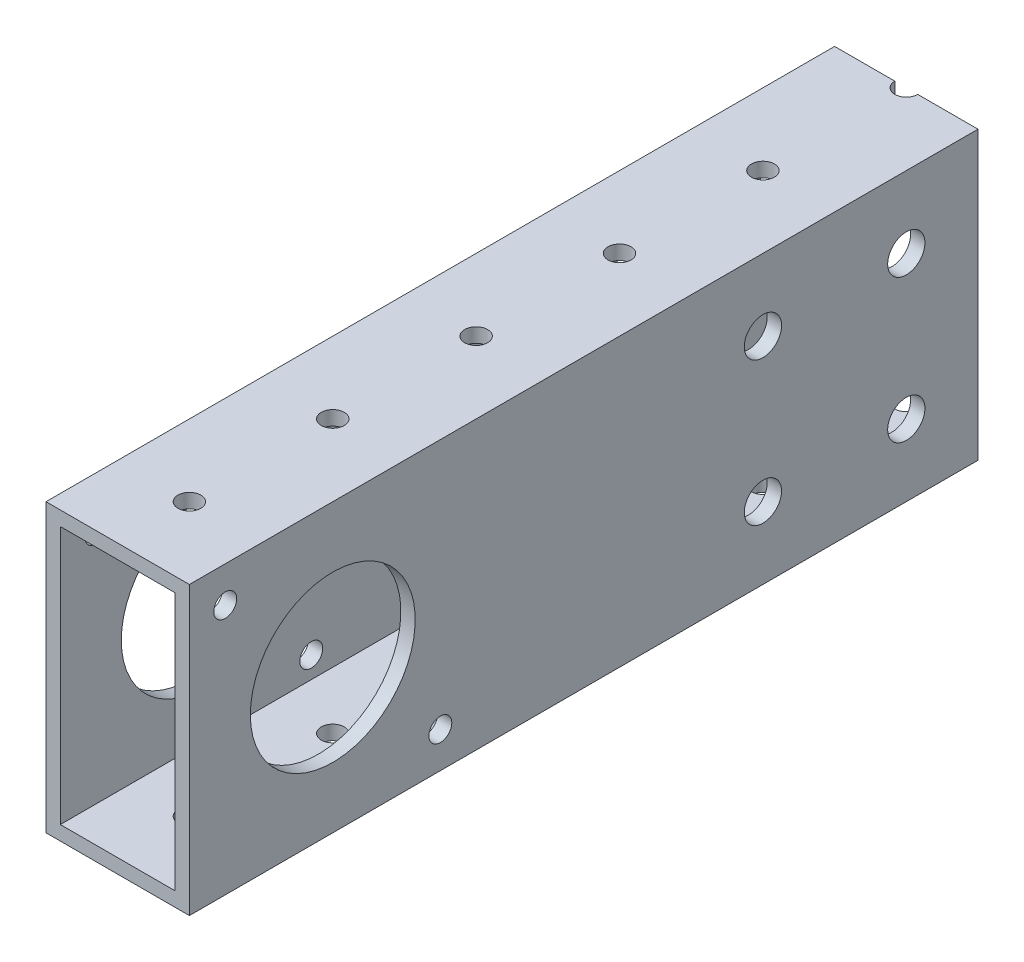
ISO-10303-21;
HEADER;
FILE_DESCRIPTION(('STEP AP214'),'2;1');
FILE_NAME('part.step','',(''),(''),'','','');
FILE_SCHEMA(('AUTOMOTIVE_DESIGN { 1 0 10303 214 1 1 1 1 }'));
ENDSEC;
DATA;
#1=APPLICATION_CONTEXT('core data for automotive mechanical design processes');
#2=APPLICATION_PROTOCOL_DEFINITION('international standard','automotive_design',2000,#1);
#3=PRODUCT_CONTEXT('',#1,'mechanical');
#4=PRODUCT('Part','Part','',(#3));
#5=PRODUCT_RELATED_PRODUCT_CATEGORY('part','',(#4));
#6=PRODUCT_DEFINITION_FORMATION('','',#4);
#7=PRODUCT_DEFINITION_CONTEXT('part definition',#1,'design');
#8=PRODUCT_DEFINITION('design','',#6,#7);
#9=PRODUCT_DEFINITION_SHAPE('','',#8);
#10=(LENGTH_UNIT() NAMED_UNIT(*) SI_UNIT(.MILLI.,.METRE.));
#11=(NAMED_UNIT(*) PLANE_ANGLE_UNIT() SI_UNIT($,.RADIAN.));
#12=(NAMED_UNIT(*) SI_UNIT($,.STERADIAN.) SOLID_ANGLE_UNIT());
#13=UNCERTAINTY_MEASURE_WITH_UNIT(LENGTH_MEASURE(1.E-05),#10,'distance_accuracy_value','');
#14=(GEOMETRIC_REPRESENTATION_CONTEXT(3) GLOBAL_UNCERTAINTY_ASSIGNED_CONTEXT((#13)) GLOBAL_UNIT_ASSIGNED_CONTEXT((#10,
#11,#12)) REPRESENTATION_CONTEXT('',''));
#15=CARTESIAN_POINT('',(0.,0.,0.));
#16=DIRECTION('',(0.,0.,1.));
#17=DIRECTION('',(1.,0.,0.));
#18=AXIS2_PLACEMENT_3D('',#15,#16,#17);
#19=CARTESIAN_POINT('',(0.,0.,0.));
#20=DIRECTION('',(0.,0.,-1.));
#21=DIRECTION('',(-1.,0.,0.));
#22=AXIS2_PLACEMENT_3D('',#19,#20,#21);
#23=PLANE('',#22);
#24=DIRECTION('',(0.,1.,0.));
#25=VECTOR('',#24,1.);
#26=CARTESIAN_POINT('',(-2.032,-25.4,0.));
#27=LINE('',#26,#25);
#28=CARTESIAN_POINT('',(-2.032,-25.4,0.));
#29=VERTEX_POINT('',#28);
#30=CARTESIAN_POINT('',(-2.032,-22.86,0.));
#31=VERTEX_POINT('',#30);
#32=EDGE_CURVE('E49',#29,#31,#27,.T.);
#33=ORIENTED_EDGE('',*,*,#32,.F.);
#34=DIRECTION('',(1.,0.,0.));
#35=VECTOR('',#34,1.);
#36=CARTESIAN_POINT('',(-12.7,-25.4,0.));
#37=LINE('',#36,#35);
#38=CARTESIAN_POINT('',(-12.7,-25.4,0.));
#39=VERTEX_POINT('',#38);
#40=EDGE_CURVE('E137',#39,#29,#37,.T.);
#41=ORIENTED_EDGE('',*,*,#40,.F.);
#42=DIRECTION('',(0.,-1.,0.));
#43=VECTOR('',#42,1.);
#44=CARTESIAN_POINT('',(-12.7,-25.4,0.));
#45=LINE('',#44,#43);
#46=CARTESIAN_POINT('',(-12.7,25.4,0.));
#47=VERTEX_POINT('',#46);
#48=EDGE_CURVE('E144',#47,#39,#45,.T.);
#49=ORIENTED_EDGE('',*,*,#48,.F.);
#50=DIRECTION('',(-1.,0.,0.));
#51=VECTOR('',#50,1.);
#52=CARTESIAN_POINT('',(-12.7,25.4,0.));
#53=LINE('',#52,#51);
#54=CARTESIAN_POINT('',(-2.032,25.4,0.));
#55=VERTEX_POINT('',#54);
#56=EDGE_CURVE('E311',#55,#47,#53,.T.);
#57=ORIENTED_EDGE('',*,*,#56,.F.);
#58=CARTESIAN_POINT('',(-2.032,22.86,0.));
#59=VERTEX_POINT('',#58);
#60=EDGE_CURVE('E267',#59,#55,#27,.T.);
#61=ORIENTED_EDGE('',*,*,#60,.F.);
#62=DIRECTION('',(-1.,0.,0.));
#63=VECTOR('',#62,1.);
#64=CARTESIAN_POINT('',(-10.16,22.86,0.));
#65=LINE('',#64,#63);
#66=CARTESIAN_POINT('',(-10.16,22.86,0.));
#67=VERTEX_POINT('',#66);
#68=EDGE_CURVE('E291',#59,#67,#65,.T.);
#69=ORIENTED_EDGE('',*,*,#68,.T.);
#70=DIRECTION('',(0.,-1.,0.));
#71=VECTOR('',#70,1.);
#72=CARTESIAN_POINT('',(-10.16,-22.86,0.));
#73=LINE('',#72,#71);
#74=CARTESIAN_POINT('',(-10.16,-22.86,0.));
#75=VERTEX_POINT('',#74);
#76=EDGE_CURVE('E281',#67,#75,#73,.T.);
#77=ORIENTED_EDGE('',*,*,#76,.T.);
#78=DIRECTION('',(1.,0.,0.));
#79=VECTOR('',#78,1.);
#80=CARTESIAN_POINT('',(-10.16,-22.86,0.));
#81=LINE('',#80,#79);
#82=EDGE_CURVE('E285',#75,#31,#81,.T.);
#83=ORIENTED_EDGE('',*,*,#82,.T.);
#84=EDGE_LOOP('',(#33,#41,#49,#57,#61,#69,#77,#83));
#85=FACE_BOUND('',#84,.T.);
#86=ADVANCED_FACE('F32',(#85),#23,.T.);
#87=CARTESIAN_POINT('',(0.,0.,139.7));
#88=DIRECTION('',(0.,0.,-1.));
#89=DIRECTION('',(-1.,0.,0.));
#90=AXIS2_PLACEMENT_3D('',#87,#88,#89);
#91=PLANE('',#90);
#92=DIRECTION('',(0.,1.,0.));
#93=VECTOR('',#92,1.);
#94=CARTESIAN_POINT('',(12.7,-25.4,139.7));
#95=LINE('',#94,#93);
#96=CARTESIAN_POINT('',(12.7,-25.4,139.7));
#97=VERTEX_POINT('',#96);
#98=CARTESIAN_POINT('',(12.7,25.4,139.7));
#99=VERTEX_POINT('',#98);
#100=EDGE_CURVE('E146',#97,#99,#95,.T.);
#101=ORIENTED_EDGE('',*,*,#100,.T.);
#102=DIRECTION('',(-1.,0.,0.));
#103=VECTOR('',#102,1.);
#104=CARTESIAN_POINT('',(-12.7,25.4,139.7));
#105=LINE('',#104,#103);
#106=CARTESIAN_POINT('',(-12.7,25.4,139.7));
#107=VERTEX_POINT('',#106);
#108=EDGE_CURVE('E306',#99,#107,#105,.T.);
#109=ORIENTED_EDGE('',*,*,#108,.T.);
#110=DIRECTION('',(0.,-1.,0.));
#111=VECTOR('',#110,1.);
#112=CARTESIAN_POINT('',(-12.7,-25.4,139.7));
#113=LINE('',#112,#111);
#114=CARTESIAN_POINT('',(-12.7,-25.4,139.7));
#115=VERTEX_POINT('',#114);
#116=EDGE_CURVE('E308',#107,#115,#113,.T.);
#117=ORIENTED_EDGE('',*,*,#116,.T.);
#118=DIRECTION('',(1.,0.,0.));
#119=VECTOR('',#118,1.);
#120=CARTESIAN_POINT('',(-12.7,-25.4,139.7));
#121=LINE('',#120,#119);
#122=EDGE_CURVE('E154',#115,#97,#121,.T.);
#123=ORIENTED_EDGE('',*,*,#122,.T.);
#124=EDGE_LOOP('',(#101,#109,#117,#123));
#125=FACE_BOUND('',#124,.T.);
#126=DIRECTION('',(0.,-1.,0.));
#127=VECTOR('',#126,1.);
#128=CARTESIAN_POINT('',(-10.16,-22.86,139.7));
#129=LINE('',#128,#127);
#130=CARTESIAN_POINT('',(-10.16,22.86,139.7));
#131=VERTEX_POINT('',#130);
#132=CARTESIAN_POINT('',(-10.16,-22.86,139.7));
#133=VERTEX_POINT('',#132);
#134=EDGE_CURVE('E270',#131,#133,#129,.T.);
#135=ORIENTED_EDGE('',*,*,#134,.F.);
#136=DIRECTION('',(-1.,0.,0.));
#137=VECTOR('',#136,1.);
#138=CARTESIAN_POINT('',(-10.16,22.86,139.7));
#139=LINE('',#138,#137);
#140=CARTESIAN_POINT('',(10.16,22.86,139.7));
#141=VERTEX_POINT('',#140);
#142=EDGE_CURVE('E278',#141,#131,#139,.T.);
#143=ORIENTED_EDGE('',*,*,#142,.F.);
#144=DIRECTION('',(0.,1.,0.));
#145=VECTOR('',#144,1.);
#146=CARTESIAN_POINT('',(10.16,-22.86,139.7));
#147=LINE('',#146,#145);
#148=CARTESIAN_POINT('',(10.16,-22.86,139.7));
#149=VERTEX_POINT('',#148);
#150=EDGE_CURVE('E275',#149,#141,#147,.T.);
#151=ORIENTED_EDGE('',*,*,#150,.F.);
#152=DIRECTION('',(1.,0.,0.));
#153=VECTOR('',#152,1.);
#154=CARTESIAN_POINT('',(-10.16,-22.86,139.7));
#155=LINE('',#154,#153);
#156=EDGE_CURVE('E272',#133,#149,#155,.T.);
#157=ORIENTED_EDGE('',*,*,#156,.F.);
#158=EDGE_LOOP('',(#135,#143,#151,#157));
#159=FACE_BOUND('',#158,.T.);
#160=ADVANCED_FACE('F336',(#125,#159),#91,.F.);
#161=DIRECTION('',(0.,1.,0.));
#162=VECTOR('',#161,1.);
#163=CARTESIAN_POINT('',(2.032,-25.4,0.));
#164=LINE('',#163,#162);
#165=CARTESIAN_POINT('',(2.032,25.4,0.));
#166=VERTEX_POINT('',#165);
#167=CARTESIAN_POINT('',(2.032,22.86,0.));
#168=VERTEX_POINT('',#167);
#169=EDGE_CURVE('E56',#166,#168,#164,.F.);
#170=ORIENTED_EDGE('',*,*,#169,.F.);
#171=CARTESIAN_POINT('',(12.7,25.4,0.));
#172=VERTEX_POINT('',#171);
#173=EDGE_CURVE('E147',#172,#166,#53,.T.);
#174=ORIENTED_EDGE('',*,*,#173,.F.);
#175=DIRECTION('',(0.,1.,0.));
#176=VECTOR('',#175,1.);
#177=CARTESIAN_POINT('',(12.7,-25.4,0.));
#178=LINE('',#177,#176);
#179=CARTESIAN_POINT('',(12.7,-25.4,0.));
#180=VERTEX_POINT('',#179);
#181=EDGE_CURVE('E143',#180,#172,#178,.T.);
#182=ORIENTED_EDGE('',*,*,#181,.F.);
#183=CARTESIAN_POINT('',(2.032,-25.4,0.));
#184=VERTEX_POINT('',#183);
#185=EDGE_CURVE('E133',#184,#180,#37,.T.);
#186=ORIENTED_EDGE('',*,*,#185,.F.);
#187=CARTESIAN_POINT('',(2.032,-22.86,0.));
#188=VERTEX_POINT('',#187);
#189=EDGE_CURVE('E120',#188,#184,#164,.F.);
#190=ORIENTED_EDGE('',*,*,#189,.F.);
#191=CARTESIAN_POINT('',(10.16,-22.86,0.));
#192=VERTEX_POINT('',#191);
#193=EDGE_CURVE('E284',#188,#192,#81,.T.);
#194=ORIENTED_EDGE('',*,*,#193,.T.);
#195=DIRECTION('',(0.,1.,0.));
#196=VECTOR('',#195,1.);
#197=CARTESIAN_POINT('',(10.16,-22.86,0.));
#198=LINE('',#197,#196);
#199=CARTESIAN_POINT('',(10.16,22.86,0.));
#200=VERTEX_POINT('',#199);
#201=EDGE_CURVE('E288',#192,#200,#198,.T.);
#202=ORIENTED_EDGE('',*,*,#201,.T.);
#203=EDGE_CURVE('E273',#200,#168,#65,.T.);
#204=ORIENTED_EDGE('',*,*,#203,.T.);
#205=EDGE_LOOP('',(#170,#174,#182,#186,#190,#194,#202,#204));
#206=FACE_BOUND('',#205,.T.);
#207=ADVANCED_FACE('F141',(#206),#23,.T.);
#208=CARTESIAN_POINT('',(12.7,-25.4,139.7));
#209=DIRECTION('',(-1.,0.,0.));
#210=DIRECTION('',(0.,0.,1.));
#211=AXIS2_PLACEMENT_3D('',#208,#209,#210);
#212=PLANE('',#211);
#213=CARTESIAN_POINT('',(12.7,-12.7,12.7));
#214=DIRECTION('',(-1.,0.,0.));
#215=DIRECTION('',(0.,0.,-1.));
#216=AXIS2_PLACEMENT_3D('',#213,#214,#215);
#217=CIRCLE('',#216,3.302);
#218=CARTESIAN_POINT('',(12.7,-12.7,9.39799999999999));
#219=VERTEX_POINT('',#218);
#220=EDGE_CURVE('E377',#219,#219,#217,.T.);
#221=ORIENTED_EDGE('',*,*,#220,.T.);
#222=EDGE_LOOP('',(#221));
#223=FACE_BOUND('',#222,.T.);
#224=CARTESIAN_POINT('',(12.7,-12.7,38.1));
#225=DIRECTION('',(-1.,0.,0.));
#226=DIRECTION('',(0.,0.,-1.));
#227=AXIS2_PLACEMENT_3D('',#224,#225,#226);
#228=CIRCLE('',#227,3.302);
#229=CARTESIAN_POINT('',(12.7,-12.7,34.798));
#230=VERTEX_POINT('',#229);
#231=EDGE_CURVE('E381',#230,#230,#228,.T.);
#232=ORIENTED_EDGE('',*,*,#231,.T.);
#233=EDGE_LOOP('',(#232));
#234=FACE_BOUND('',#233,.T.);
#235=CARTESIAN_POINT('',(12.7,12.7,38.1));
#236=DIRECTION('',(-1.,0.,0.));
#237=DIRECTION('',(0.,0.,1.));
#238=AXIS2_PLACEMENT_3D('',#235,#236,#237);
#239=CIRCLE('',#238,3.302);
#240=CARTESIAN_POINT('',(12.7,12.7,41.402));
#241=VERTEX_POINT('',#240);
#242=EDGE_CURVE('E385',#241,#241,#239,.T.);
#243=ORIENTED_EDGE('',*,*,#242,.T.);
#244=EDGE_LOOP('',(#243));
#245=FACE_BOUND('',#244,.T.);
#246=CARTESIAN_POINT('',(12.7,12.7,12.7));
#247=DIRECTION('',(-1.,0.,0.));
#248=DIRECTION('',(0.,0.,1.));
#249=AXIS2_PLACEMENT_3D('',#246,#247,#248);
#250=CIRCLE('',#249,3.302);
#251=CARTESIAN_POINT('',(12.7,12.7,16.002));
#252=VERTEX_POINT('',#251);
#253=EDGE_CURVE('E389',#252,#252,#250,.T.);
#254=ORIENTED_EDGE('',*,*,#253,.T.);
#255=EDGE_LOOP('',(#254));
#256=FACE_BOUND('',#255,.T.);
#257=CARTESIAN_POINT('',(12.7,0.,114.3));
#258=DIRECTION('',(-1.,0.,0.));
#259=DIRECTION('',(0.,0.,1.));
#260=AXIS2_PLACEMENT_3D('',#257,#258,#259);
#261=CIRCLE('',#260,14.605);
#262=CARTESIAN_POINT('',(12.7,0.,128.905));
#263=VERTEX_POINT('',#262);
#264=EDGE_CURVE('E393',#263,#263,#261,.T.);
#265=ORIENTED_EDGE('',*,*,#264,.T.);
#266=EDGE_LOOP('',(#265));
#267=FACE_BOUND('',#266,.T.);
#268=CARTESIAN_POINT('',(12.7,-19.05,95.25));
#269=DIRECTION('',(-1.,0.,0.));
#270=DIRECTION('',(0.,0.,1.));
#271=AXIS2_PLACEMENT_3D('',#268,#269,#270);
#272=CIRCLE('',#271,2.03200000000001);
#273=CARTESIAN_POINT('',(12.7,-19.05,97.282));
#274=VERTEX_POINT('',#273);
#275=EDGE_CURVE('E191',#274,#274,#272,.T.);
#276=ORIENTED_EDGE('',*,*,#275,.T.);
#277=EDGE_LOOP('',(#276));
#278=FACE_BOUND('',#277,.T.);
#279=CARTESIAN_POINT('',(12.7,19.05,133.35));
#280=DIRECTION('',(-1.,0.,0.));
#281=DIRECTION('',(0.,0.,1.));
#282=AXIS2_PLACEMENT_3D('',#279,#280,#281);
#283=CIRCLE('',#282,2.03200000000001);
#284=CARTESIAN_POINT('',(12.7,19.05,135.382));
#285=VERTEX_POINT('',#284);
#286=EDGE_CURVE('E186',#285,#285,#283,.T.);
#287=ORIENTED_EDGE('',*,*,#286,.T.);
#288=EDGE_LOOP('',(#287));
#289=FACE_BOUND('',#288,.T.);
#290=ORIENTED_EDGE('',*,*,#181,.T.);
#291=DIRECTION('',(0.,0.,-1.));
#292=VECTOR('',#291,1.);
#293=CARTESIAN_POINT('',(12.7,25.4,139.7));
#294=LINE('',#293,#292);
#295=EDGE_CURVE('E41',#99,#172,#294,.T.);
#296=ORIENTED_EDGE('',*,*,#295,.F.);
#297=ORIENTED_EDGE('',*,*,#100,.F.);
#298=DIRECTION('',(0.,0.,-1.));
#299=VECTOR('',#298,1.);
#300=CARTESIAN_POINT('',(12.7,-25.4,139.7));
#301=LINE('',#300,#299);
#302=EDGE_CURVE('E151',#97,#180,#301,.T.);
#303=ORIENTED_EDGE('',*,*,#302,.T.);
#304=EDGE_LOOP('',(#290,#296,#297,#303));
#305=FACE_BOUND('',#304,.T.);
#306=ADVANCED_FACE('F34',(#223,#234,#245,#256,#267,#278,#289,#305),#212,.F.);
#307=CARTESIAN_POINT('',(-12.7,25.4,139.7));
#308=DIRECTION('',(0.,-1.,0.));
#309=DIRECTION('',(0.,0.,-1.));
#310=AXIS2_PLACEMENT_3D('',#307,#308,#309);
#311=PLANE('',#310);
#312=CARTESIAN_POINT('',(0.,25.4,25.4));
#313=DIRECTION('',(0.,1.,0.));
#314=DIRECTION('',(0.,0.,1.));
#315=AXIS2_PLACEMENT_3D('',#312,#313,#314);
#316=CIRCLE('',#315,2.032);
#317=CARTESIAN_POINT('',(0.,25.4,27.432));
#318=VERTEX_POINT('',#317);
#319=EDGE_CURVE('E230',#318,#318,#316,.T.);
#320=ORIENTED_EDGE('',*,*,#319,.F.);
#321=EDGE_LOOP('',(#320));
#322=FACE_BOUND('',#321,.T.);
#323=CARTESIAN_POINT('',(0.,25.4,50.8));
#324=DIRECTION('',(0.,1.,0.));
#325=DIRECTION('',(0.,0.,1.));
#326=AXIS2_PLACEMENT_3D('',#323,#324,#325);
#327=CIRCLE('',#326,2.032);
#328=CARTESIAN_POINT('',(0.,25.4,52.832));
#329=VERTEX_POINT('',#328);
#330=EDGE_CURVE('E236',#329,#329,#327,.T.);
#331=ORIENTED_EDGE('',*,*,#330,.F.);
#332=EDGE_LOOP('',(#331));
#333=FACE_BOUND('',#332,.T.);
#334=CARTESIAN_POINT('',(0.,25.4,76.2));
#335=DIRECTION('',(0.,1.,0.));
#336=DIRECTION('',(0.,0.,1.));
#337=AXIS2_PLACEMENT_3D('',#334,#335,#336);
#338=CIRCLE('',#337,2.032);
#339=CARTESIAN_POINT('',(0.,25.4,78.232));
#340=VERTEX_POINT('',#339);
#341=EDGE_CURVE('E242',#340,#340,#338,.T.);
#342=ORIENTED_EDGE('',*,*,#341,.F.);
#343=EDGE_LOOP('',(#342));
#344=FACE_BOUND('',#343,.T.);
#345=CARTESIAN_POINT('',(0.,25.4,101.6));
#346=DIRECTION('',(0.,1.,0.));
#347=DIRECTION('',(0.,0.,1.));
#348=AXIS2_PLACEMENT_3D('',#345,#346,#347);
#349=CIRCLE('',#348,2.032);
#350=CARTESIAN_POINT('',(0.,25.4,103.632));
#351=VERTEX_POINT('',#350);
#352=EDGE_CURVE('E248',#351,#351,#349,.T.);
#353=ORIENTED_EDGE('',*,*,#352,.F.);
#354=EDGE_LOOP('',(#353));
#355=FACE_BOUND('',#354,.T.);
#356=CARTESIAN_POINT('',(0.,25.4,127.));
#357=DIRECTION('',(0.,1.,0.));
#358=DIRECTION('',(0.,0.,1.));
#359=AXIS2_PLACEMENT_3D('',#356,#357,#358);
#360=CIRCLE('',#359,2.032);
#361=CARTESIAN_POINT('',(0.,25.4,129.032));
#362=VERTEX_POINT('',#361);
#363=EDGE_CURVE('E227',#362,#362,#360,.T.);
#364=ORIENTED_EDGE('',*,*,#363,.F.);
#365=EDGE_LOOP('',(#364));
#366=FACE_BOUND('',#365,.T.);
#367=ORIENTED_EDGE('',*,*,#173,.T.);
#368=CARTESIAN_POINT('',(0.,25.4,0.));
#369=DIRECTION('',(0.,1.,0.));
#370=DIRECTION('',(0.,0.,1.));
#371=AXIS2_PLACEMENT_3D('',#368,#369,#370);
#372=CIRCLE('',#371,2.032);
#373=EDGE_CURVE('E138',#55,#166,#372,.T.);
#374=ORIENTED_EDGE('',*,*,#373,.F.);
#375=ORIENTED_EDGE('',*,*,#56,.T.);
#376=DIRECTION('',(0.,0.,-1.));
#377=VECTOR('',#376,1.);
#378=CARTESIAN_POINT('',(-12.7,25.4,139.7));
#379=LINE('',#378,#377);
#380=EDGE_CURVE('E156',#107,#47,#379,.T.);
#381=ORIENTED_EDGE('',*,*,#380,.F.);
#382=ORIENTED_EDGE('',*,*,#108,.F.);
#383=ORIENTED_EDGE('',*,*,#295,.T.);
#384=EDGE_LOOP('',(#367,#374,#375,#381,#382,#383));
#385=FACE_BOUND('',#384,.T.);
#386=ADVANCED_FACE('F317',(#322,#333,#344,#355,#366,#385),#311,.F.);
#387=CARTESIAN_POINT('',(-12.7,-25.4,139.7));
#388=DIRECTION('',(1.,0.,0.));
#389=DIRECTION('',(0.,0.,-1.));
#390=AXIS2_PLACEMENT_3D('',#387,#388,#389);
#391=PLANE('',#390);
#392=CARTESIAN_POINT('',(-12.7,-12.7,12.7));
#393=DIRECTION('',(-1.,0.,0.));
#394=DIRECTION('',(0.,0.,-1.));
#395=AXIS2_PLACEMENT_3D('',#392,#393,#394);
#396=CIRCLE('',#395,3.302);
#397=CARTESIAN_POINT('',(-12.7,-12.7,9.39799999999999));
#398=VERTEX_POINT('',#397);
#399=EDGE_CURVE('E523',#398,#398,#396,.T.);
#400=ORIENTED_EDGE('',*,*,#399,.F.);
#401=EDGE_LOOP('',(#400));
#402=FACE_BOUND('',#401,.T.);
#403=CARTESIAN_POINT('',(-12.7,-12.7,38.1));
#404=DIRECTION('',(-1.,0.,0.));
#405=DIRECTION('',(0.,0.,-1.));
#406=AXIS2_PLACEMENT_3D('',#403,#404,#405);
#407=CIRCLE('',#406,3.302);
#408=CARTESIAN_POINT('',(-12.7,-12.7,34.798));
#409=VERTEX_POINT('',#408);
#410=EDGE_CURVE('E603',#409,#409,#407,.T.);
#411=ORIENTED_EDGE('',*,*,#410,.F.);
#412=EDGE_LOOP('',(#411));
#413=FACE_BOUND('',#412,.T.);
#414=CARTESIAN_POINT('',(-12.7,12.7,38.1));
#415=DIRECTION('',(-1.,0.,0.));
#416=DIRECTION('',(0.,0.,1.));
#417=AXIS2_PLACEMENT_3D('',#414,#415,#416);
#418=CIRCLE('',#417,3.302);
#419=CARTESIAN_POINT('',(-12.7,12.7,41.402));
#420=VERTEX_POINT('',#419);
#421=EDGE_CURVE('E602',#420,#420,#418,.T.);
#422=ORIENTED_EDGE('',*,*,#421,.F.);
#423=EDGE_LOOP('',(#422));
#424=FACE_BOUND('',#423,.T.);
#425=CARTESIAN_POINT('',(-12.7,12.7,12.7));
#426=DIRECTION('',(-1.,0.,0.));
#427=DIRECTION('',(0.,0.,1.));
#428=AXIS2_PLACEMENT_3D('',#425,#426,#427);
#429=CIRCLE('',#428,3.302);
#430=CARTESIAN_POINT('',(-12.7,12.7,16.002));
#431=VERTEX_POINT('',#430);
#432=EDGE_CURVE('E531',#431,#431,#429,.T.);
#433=ORIENTED_EDGE('',*,*,#432,.F.);
#434=EDGE_LOOP('',(#433));
#435=FACE_BOUND('',#434,.T.);
#436=CARTESIAN_POINT('',(-12.7,0.,114.3));
#437=DIRECTION('',(-1.,0.,0.));
#438=DIRECTION('',(0.,0.,1.));
#439=AXIS2_PLACEMENT_3D('',#436,#437,#438);
#440=CIRCLE('',#439,14.605);
#441=CARTESIAN_POINT('',(-12.7,0.,128.905));
#442=VERTEX_POINT('',#441);
#443=EDGE_CURVE('E527',#442,#442,#440,.T.);
#444=ORIENTED_EDGE('',*,*,#443,.F.);
#445=EDGE_LOOP('',(#444));
#446=FACE_BOUND('',#445,.T.);
#447=CARTESIAN_POINT('',(-12.7,-19.05,95.25));
#448=DIRECTION('',(-1.,0.,0.));
#449=DIRECTION('',(0.,0.,1.));
#450=AXIS2_PLACEMENT_3D('',#447,#448,#449);
#451=CIRCLE('',#450,2.03200000000001);
#452=CARTESIAN_POINT('',(-12.7,-19.05,97.282));
#453=VERTEX_POINT('',#452);
#454=EDGE_CURVE('E518',#453,#453,#451,.T.);
#455=ORIENTED_EDGE('',*,*,#454,.F.);
#456=EDGE_LOOP('',(#455));
#457=FACE_BOUND('',#456,.T.);
#458=CARTESIAN_POINT('',(-12.7,19.05,133.35));
#459=DIRECTION('',(-1.,0.,0.));
#460=DIRECTION('',(0.,0.,1.));
#461=AXIS2_PLACEMENT_3D('',#458,#459,#460);
#462=CIRCLE('',#461,2.03200000000001);
#463=CARTESIAN_POINT('',(-12.7,19.05,135.382));
#464=VERTEX_POINT('',#463);
#465=EDGE_CURVE('E220',#464,#464,#462,.T.);
#466=ORIENTED_EDGE('',*,*,#465,.F.);
#467=EDGE_LOOP('',(#466));
#468=FACE_BOUND('',#467,.T.);
#469=ORIENTED_EDGE('',*,*,#48,.T.);
#470=DIRECTION('',(0.,0.,-1.));
#471=VECTOR('',#470,1.);
#472=CARTESIAN_POINT('',(-12.7,-25.4,139.7));
#473=LINE('',#472,#471);
#474=EDGE_CURVE('E153',#115,#39,#473,.T.);
#475=ORIENTED_EDGE('',*,*,#474,.F.);
#476=ORIENTED_EDGE('',*,*,#116,.F.);
#477=ORIENTED_EDGE('',*,*,#380,.T.);
#478=EDGE_LOOP('',(#469,#475,#476,#477));
#479=FACE_BOUND('',#478,.T.);
#480=ADVANCED_FACE('F323',(#402,#413,#424,#435,#446,#457,#468,#479),#391,.F.);
#481=CARTESIAN_POINT('',(-12.7,-25.4,139.7));
#482=DIRECTION('',(0.,1.,0.));
#483=DIRECTION('',(0.,0.,1.));
#484=AXIS2_PLACEMENT_3D('',#481,#482,#483);
#485=PLANE('',#484);
#486=CARTESIAN_POINT('',(0.,-25.4,25.4));
#487=DIRECTION('',(0.,1.,0.));
#488=DIRECTION('',(0.,0.,1.));
#489=AXIS2_PLACEMENT_3D('',#486,#487,#488);
#490=CIRCLE('',#489,2.032);
#491=CARTESIAN_POINT('',(0.,-25.4,27.432));
#492=VERTEX_POINT('',#491);
#493=EDGE_CURVE('E165',#492,#492,#490,.T.);
#494=ORIENTED_EDGE('',*,*,#493,.T.);
#495=EDGE_LOOP('',(#494));
#496=FACE_BOUND('',#495,.T.);
#497=CARTESIAN_POINT('',(0.,-25.4,50.8));
#498=DIRECTION('',(0.,1.,0.));
#499=DIRECTION('',(0.,0.,1.));
#500=AXIS2_PLACEMENT_3D('',#497,#498,#499);
#501=CIRCLE('',#500,2.032);
#502=CARTESIAN_POINT('',(0.,-25.4,52.832));
#503=VERTEX_POINT('',#502);
#504=EDGE_CURVE('E233',#503,#503,#501,.T.);
#505=ORIENTED_EDGE('',*,*,#504,.T.);
#506=EDGE_LOOP('',(#505));
#507=FACE_BOUND('',#506,.T.);
#508=CARTESIAN_POINT('',(0.,-25.4,76.2));
#509=DIRECTION('',(0.,1.,0.));
#510=DIRECTION('',(0.,0.,1.));
#511=AXIS2_PLACEMENT_3D('',#508,#509,#510);
#512=CIRCLE('',#511,2.032);
#513=CARTESIAN_POINT('',(0.,-25.4,78.232));
#514=VERTEX_POINT('',#513);
#515=EDGE_CURVE('E239',#514,#514,#512,.T.);
#516=ORIENTED_EDGE('',*,*,#515,.T.);
#517=EDGE_LOOP('',(#516));
#518=FACE_BOUND('',#517,.T.);
#519=CARTESIAN_POINT('',(0.,-25.4,101.6));
#520=DIRECTION('',(0.,1.,0.));
#521=DIRECTION('',(0.,0.,1.));
#522=AXIS2_PLACEMENT_3D('',#519,#520,#521);
#523=CIRCLE('',#522,2.032);
#524=CARTESIAN_POINT('',(0.,-25.4,103.632));
#525=VERTEX_POINT('',#524);
#526=EDGE_CURVE('E245',#525,#525,#523,.T.);
#527=ORIENTED_EDGE('',*,*,#526,.T.);
#528=EDGE_LOOP('',(#527));
#529=FACE_BOUND('',#528,.T.);
#530=CARTESIAN_POINT('',(0.,-25.4,127.));
#531=DIRECTION('',(0.,1.,0.));
#532=DIRECTION('',(0.,0.,1.));
#533=AXIS2_PLACEMENT_3D('',#530,#531,#532);
#534=CIRCLE('',#533,2.032);
#535=CARTESIAN_POINT('',(0.,-25.4,129.032));
#536=VERTEX_POINT('',#535);
#537=EDGE_CURVE('E251',#536,#536,#534,.T.);
#538=ORIENTED_EDGE('',*,*,#537,.T.);
#539=EDGE_LOOP('',(#538));
#540=FACE_BOUND('',#539,.T.);
#541=ORIENTED_EDGE('',*,*,#40,.T.);
#542=CARTESIAN_POINT('',(0.,-25.4,0.));
#543=DIRECTION('',(0.,1.,0.));
#544=DIRECTION('',(0.,0.,1.));
#545=AXIS2_PLACEMENT_3D('',#542,#543,#544);
#546=CIRCLE('',#545,2.032);
#547=EDGE_CURVE('E123',#29,#184,#546,.T.);
#548=ORIENTED_EDGE('',*,*,#547,.T.);
#549=ORIENTED_EDGE('',*,*,#185,.T.);
#550=ORIENTED_EDGE('',*,*,#302,.F.);
#551=ORIENTED_EDGE('',*,*,#122,.F.);
#552=ORIENTED_EDGE('',*,*,#474,.T.);
#553=EDGE_LOOP('',(#541,#548,#549,#550,#551,#552));
#554=FACE_BOUND('',#553,.T.);
#555=ADVANCED_FACE('F131',(#496,#507,#518,#529,#540,#554),#485,.F.);
#556=CARTESIAN_POINT('',(-10.16,-22.86,139.7));
#557=DIRECTION('',(1.,0.,0.));
#558=DIRECTION('',(0.,0.,-1.));
#559=AXIS2_PLACEMENT_3D('',#556,#557,#558);
#560=PLANE('',#559);
#561=CARTESIAN_POINT('',(-10.16,-12.7,12.7));
#562=DIRECTION('',(1.,0.,0.));
#563=DIRECTION('',(0.,0.,-1.));
#564=AXIS2_PLACEMENT_3D('',#561,#562,#563);
#565=CIRCLE('',#564,3.302);
#566=CARTESIAN_POINT('',(-10.16,-12.7,9.39799999999999));
#567=VERTEX_POINT('',#566);
#568=EDGE_CURVE('E217',#567,#567,#565,.T.);
#569=ORIENTED_EDGE('',*,*,#568,.F.);
#570=EDGE_LOOP('',(#569));
#571=FACE_BOUND('',#570,.T.);
#572=CARTESIAN_POINT('',(-10.16,-12.7,38.1));
#573=DIRECTION('',(1.,0.,0.));
#574=DIRECTION('',(0.,0.,-1.));
#575=AXIS2_PLACEMENT_3D('',#572,#573,#574);
#576=CIRCLE('',#575,3.302);
#577=CARTESIAN_POINT('',(-10.16,-12.7,34.798));
#578=VERTEX_POINT('',#577);
#579=EDGE_CURVE('E205',#578,#578,#576,.T.);
#580=ORIENTED_EDGE('',*,*,#579,.F.);
#581=EDGE_LOOP('',(#580));
#582=FACE_BOUND('',#581,.T.);
#583=CARTESIAN_POINT('',(-10.16,12.7,38.1));
#584=DIRECTION('',(1.,0.,0.));
#585=DIRECTION('',(0.,0.,-1.));
#586=AXIS2_PLACEMENT_3D('',#583,#584,#585);
#587=CIRCLE('',#586,3.302);
#588=CARTESIAN_POINT('',(-10.16,12.7,34.798));
#589=VERTEX_POINT('',#588);
#590=EDGE_CURVE('E202',#589,#589,#587,.T.);
#591=ORIENTED_EDGE('',*,*,#590,.F.);
#592=EDGE_LOOP('',(#591));
#593=FACE_BOUND('',#592,.T.);
#594=CARTESIAN_POINT('',(-10.16,12.7,12.7));
#595=DIRECTION('',(1.,0.,0.));
#596=DIRECTION('',(0.,0.,-1.));
#597=AXIS2_PLACEMENT_3D('',#594,#595,#596);
#598=CIRCLE('',#597,3.302);
#599=CARTESIAN_POINT('',(-10.16,12.7,9.39799999999999));
#600=VERTEX_POINT('',#599);
#601=EDGE_CURVE('E199',#600,#600,#598,.T.);
#602=ORIENTED_EDGE('',*,*,#601,.F.);
#603=EDGE_LOOP('',(#602));
#604=FACE_BOUND('',#603,.T.);
#605=CARTESIAN_POINT('',(-10.16,0.,114.3));
#606=DIRECTION('',(1.,0.,0.));
#607=DIRECTION('',(0.,0.,-1.));
#608=AXIS2_PLACEMENT_3D('',#605,#606,#607);
#609=CIRCLE('',#608,14.605);
#610=CARTESIAN_POINT('',(-10.16,0.,99.695));
#611=VERTEX_POINT('',#610);
#612=EDGE_CURVE('E195',#611,#611,#609,.T.);
#613=ORIENTED_EDGE('',*,*,#612,.F.);
#614=EDGE_LOOP('',(#613));
#615=FACE_BOUND('',#614,.T.);
#616=CARTESIAN_POINT('',(-10.16,-19.05,95.25));
#617=DIRECTION('',(1.,0.,0.));
#618=DIRECTION('',(0.,0.,-1.));
#619=AXIS2_PLACEMENT_3D('',#616,#617,#618);
#620=CIRCLE('',#619,2.03200000000001);
#621=CARTESIAN_POINT('',(-10.16,-19.05,93.218));
#622=VERTEX_POINT('',#621);
#623=EDGE_CURVE('E190',#622,#622,#620,.T.);
#624=ORIENTED_EDGE('',*,*,#623,.F.);
#625=EDGE_LOOP('',(#624));
#626=FACE_BOUND('',#625,.T.);
#627=CARTESIAN_POINT('',(-10.16,19.05,133.35));
#628=DIRECTION('',(1.,0.,0.));
#629=DIRECTION('',(0.,0.,-1.));
#630=AXIS2_PLACEMENT_3D('',#627,#628,#629);
#631=CIRCLE('',#630,2.03200000000001);
#632=CARTESIAN_POINT('',(-10.16,19.05,131.318));
#633=VERTEX_POINT('',#632);
#634=EDGE_CURVE('E185',#633,#633,#631,.T.);
#635=ORIENTED_EDGE('',*,*,#634,.F.);
#636=EDGE_LOOP('',(#635));
#637=FACE_BOUND('',#636,.T.);
#638=ORIENTED_EDGE('',*,*,#76,.F.);
#639=DIRECTION('',(0.,0.,-1.));
#640=VECTOR('',#639,1.);
#641=CARTESIAN_POINT('',(-10.16,22.86,139.7));
#642=LINE('',#641,#640);
#643=EDGE_CURVE('E280',#131,#67,#642,.T.);
#644=ORIENTED_EDGE('',*,*,#643,.F.);
#645=ORIENTED_EDGE('',*,*,#134,.T.);
#646=DIRECTION('',(0.,0.,-1.));
#647=VECTOR('',#646,1.);
#648=CARTESIAN_POINT('',(-10.16,-22.86,139.7));
#649=LINE('',#648,#647);
#650=EDGE_CURVE('E301',#133,#75,#649,.T.);
#651=ORIENTED_EDGE('',*,*,#650,.T.);
#652=EDGE_LOOP('',(#638,#644,#645,#651));
#653=FACE_BOUND('',#652,.T.);
#654=ADVANCED_FACE('F331',(#571,#582,#593,#604,#615,#626,#637,#653),#560,.T.);
#655=CARTESIAN_POINT('',(-10.16,-22.86,139.7));
#656=DIRECTION('',(0.,1.,0.));
#657=DIRECTION('',(0.,0.,1.));
#658=AXIS2_PLACEMENT_3D('',#655,#656,#657);
#659=PLANE('',#658);
#660=CARTESIAN_POINT('',(0.,-22.86,25.4));
#661=DIRECTION('',(0.,1.,0.));
#662=DIRECTION('',(0.,0.,1.));
#663=AXIS2_PLACEMENT_3D('',#660,#661,#662);
#664=CIRCLE('',#663,2.032);
#665=CARTESIAN_POINT('',(0.,-22.86,27.432));
#666=VERTEX_POINT('',#665);
#667=EDGE_CURVE('E181',#666,#666,#664,.T.);
#668=ORIENTED_EDGE('',*,*,#667,.F.);
#669=EDGE_LOOP('',(#668));
#670=FACE_BOUND('',#669,.T.);
#671=CARTESIAN_POINT('',(0.,-22.86,50.8));
#672=DIRECTION('',(0.,1.,0.));
#673=DIRECTION('',(0.,0.,1.));
#674=AXIS2_PLACEMENT_3D('',#671,#672,#673);
#675=CIRCLE('',#674,2.032);
#676=CARTESIAN_POINT('',(0.,-22.86,52.832));
#677=VERTEX_POINT('',#676);
#678=EDGE_CURVE('E177',#677,#677,#675,.T.);
#679=ORIENTED_EDGE('',*,*,#678,.F.);
#680=EDGE_LOOP('',(#679));
#681=FACE_BOUND('',#680,.T.);
#682=CARTESIAN_POINT('',(0.,-22.86,76.2));
#683=DIRECTION('',(0.,1.,0.));
#684=DIRECTION('',(0.,0.,1.));
#685=AXIS2_PLACEMENT_3D('',#682,#683,#684);
#686=CIRCLE('',#685,2.032);
#687=CARTESIAN_POINT('',(0.,-22.86,78.232));
#688=VERTEX_POINT('',#687);
#689=EDGE_CURVE('E173',#688,#688,#686,.T.);
#690=ORIENTED_EDGE('',*,*,#689,.F.);
#691=EDGE_LOOP('',(#690));
#692=FACE_BOUND('',#691,.T.);
#693=CARTESIAN_POINT('',(0.,-22.86,101.6));
#694=DIRECTION('',(0.,1.,0.));
#695=DIRECTION('',(0.,0.,1.));
#696=AXIS2_PLACEMENT_3D('',#693,#694,#695);
#697=CIRCLE('',#696,2.032);
#698=CARTESIAN_POINT('',(0.,-22.86,103.632));
#699=VERTEX_POINT('',#698);
#700=EDGE_CURVE('E169',#699,#699,#697,.T.);
#701=ORIENTED_EDGE('',*,*,#700,.F.);
#702=EDGE_LOOP('',(#701));
#703=FACE_BOUND('',#702,.T.);
#704=CARTESIAN_POINT('',(0.,-22.86,127.));
#705=DIRECTION('',(0.,1.,0.));
#706=DIRECTION('',(0.,0.,1.));
#707=AXIS2_PLACEMENT_3D('',#704,#705,#706);
#708=CIRCLE('',#707,2.032);
#709=CARTESIAN_POINT('',(0.,-22.86,129.032));
#710=VERTEX_POINT('',#709);
#711=EDGE_CURVE('E164',#710,#710,#708,.T.);
#712=ORIENTED_EDGE('',*,*,#711,.F.);
#713=EDGE_LOOP('',(#712));
#714=FACE_BOUND('',#713,.T.);
#715=CARTESIAN_POINT('',(0.,-22.86,0.));
#716=DIRECTION('',(0.,1.,0.));
#717=DIRECTION('',(0.,0.,1.));
#718=AXIS2_PLACEMENT_3D('',#715,#716,#717);
#719=CIRCLE('',#718,2.032);
#720=EDGE_CURVE('E124',#31,#188,#719,.T.);
#721=ORIENTED_EDGE('',*,*,#720,.F.);
#722=ORIENTED_EDGE('',*,*,#82,.F.);
#723=ORIENTED_EDGE('',*,*,#650,.F.);
#724=ORIENTED_EDGE('',*,*,#156,.T.);
#725=DIRECTION('',(0.,0.,-1.));
#726=VECTOR('',#725,1.);
#727=CARTESIAN_POINT('',(10.16,-22.86,139.7));
#728=LINE('',#727,#726);
#729=EDGE_CURVE('E298',#149,#192,#728,.T.);
#730=ORIENTED_EDGE('',*,*,#729,.T.);
#731=ORIENTED_EDGE('',*,*,#193,.F.);
#732=EDGE_LOOP('',(#721,#722,#723,#724,#730,#731));
#733=FACE_BOUND('',#732,.T.);
#734=ADVANCED_FACE('F328',(#670,#681,#692,#703,#714,#733),#659,.T.);
#735=CARTESIAN_POINT('',(10.16,-22.86,139.7));
#736=DIRECTION('',(-1.,0.,0.));
#737=DIRECTION('',(0.,0.,1.));
#738=AXIS2_PLACEMENT_3D('',#735,#736,#737);
#739=PLANE('',#738);
#740=CARTESIAN_POINT('',(10.16,-12.7,12.7));
#741=DIRECTION('',(-1.,0.,0.));
#742=DIRECTION('',(0.,0.,1.));
#743=AXIS2_PLACEMENT_3D('',#740,#741,#742);
#744=CIRCLE('',#743,3.302);
#745=CARTESIAN_POINT('',(10.16,-12.7,16.002));
#746=VERTEX_POINT('',#745);
#747=EDGE_CURVE('E36',#746,#746,#744,.T.);
#748=ORIENTED_EDGE('',*,*,#747,.F.);
#749=EDGE_LOOP('',(#748));
#750=FACE_BOUND('',#749,.T.);
#751=CARTESIAN_POINT('',(10.16,-12.7,38.1));
#752=DIRECTION('',(-1.,0.,0.));
#753=DIRECTION('',(0.,0.,1.));
#754=AXIS2_PLACEMENT_3D('',#751,#752,#753);
#755=CIRCLE('',#754,3.302);
#756=CARTESIAN_POINT('',(10.16,-12.7,41.402));
#757=VERTEX_POINT('',#756);
#758=EDGE_CURVE('E203',#757,#757,#755,.T.);
#759=ORIENTED_EDGE('',*,*,#758,.F.);
#760=EDGE_LOOP('',(#759));
#761=FACE_BOUND('',#760,.T.);
#762=CARTESIAN_POINT('',(10.16,12.7,38.1));
#763=DIRECTION('',(-1.,0.,0.));
#764=DIRECTION('',(0.,0.,1.));
#765=AXIS2_PLACEMENT_3D('',#762,#763,#764);
#766=CIRCLE('',#765,3.302);
#767=CARTESIAN_POINT('',(10.16,12.7,41.402));
#768=VERTEX_POINT('',#767);
#769=EDGE_CURVE('E200',#768,#768,#766,.T.);
#770=ORIENTED_EDGE('',*,*,#769,.F.);
#771=EDGE_LOOP('',(#770));
#772=FACE_BOUND('',#771,.T.);
#773=CARTESIAN_POINT('',(10.16,12.7,12.7));
#774=DIRECTION('',(-1.,0.,0.));
#775=DIRECTION('',(0.,0.,1.));
#776=AXIS2_PLACEMENT_3D('',#773,#774,#775);
#777=CIRCLE('',#776,3.302);
#778=CARTESIAN_POINT('',(10.16,12.7,16.002));
#779=VERTEX_POINT('',#778);
#780=EDGE_CURVE('E196',#779,#779,#777,.T.);
#781=ORIENTED_EDGE('',*,*,#780,.F.);
#782=EDGE_LOOP('',(#781));
#783=FACE_BOUND('',#782,.T.);
#784=CARTESIAN_POINT('',(10.16,0.,114.3));
#785=DIRECTION('',(-1.,0.,0.));
#786=DIRECTION('',(0.,0.,1.));
#787=AXIS2_PLACEMENT_3D('',#784,#785,#786);
#788=CIRCLE('',#787,14.605);
#789=CARTESIAN_POINT('',(10.16,0.,128.905));
#790=VERTEX_POINT('',#789);
#791=EDGE_CURVE('E192',#790,#790,#788,.T.);
#792=ORIENTED_EDGE('',*,*,#791,.F.);
#793=EDGE_LOOP('',(#792));
#794=FACE_BOUND('',#793,.T.);
#795=CARTESIAN_POINT('',(10.16,-19.05,95.25));
#796=DIRECTION('',(-1.,0.,0.));
#797=DIRECTION('',(0.,0.,1.));
#798=AXIS2_PLACEMENT_3D('',#795,#796,#797);
#799=CIRCLE('',#798,2.03200000000001);
#800=CARTESIAN_POINT('',(10.16,-19.05,97.282));
#801=VERTEX_POINT('',#800);
#802=EDGE_CURVE('E187',#801,#801,#799,.T.);
#803=ORIENTED_EDGE('',*,*,#802,.F.);
#804=EDGE_LOOP('',(#803));
#805=FACE_BOUND('',#804,.T.);
#806=CARTESIAN_POINT('',(10.16,19.05,133.35));
#807=DIRECTION('',(-1.,0.,0.));
#808=DIRECTION('',(0.,0.,1.));
#809=AXIS2_PLACEMENT_3D('',#806,#807,#808);
#810=CIRCLE('',#809,2.03200000000001);
#811=CARTESIAN_POINT('',(10.16,19.05,135.382));
#812=VERTEX_POINT('',#811);
#813=EDGE_CURVE('E182',#812,#812,#810,.T.);
#814=ORIENTED_EDGE('',*,*,#813,.F.);
#815=EDGE_LOOP('',(#814));
#816=FACE_BOUND('',#815,.T.);
#817=ORIENTED_EDGE('',*,*,#201,.F.);
#818=ORIENTED_EDGE('',*,*,#729,.F.);
#819=ORIENTED_EDGE('',*,*,#150,.T.);
#820=DIRECTION('',(0.,0.,-1.));
#821=VECTOR('',#820,1.);
#822=CARTESIAN_POINT('',(10.16,22.86,139.7));
#823=LINE('',#822,#821);
#824=EDGE_CURVE('E296',#141,#200,#823,.T.);
#825=ORIENTED_EDGE('',*,*,#824,.T.);
#826=EDGE_LOOP('',(#817,#818,#819,#825));
#827=FACE_BOUND('',#826,.T.);
#828=ADVANCED_FACE('F341',(#750,#761,#772,#783,#794,#805,#816,#827),#739,.T.);
#829=CARTESIAN_POINT('',(-10.16,22.86,139.7));
#830=DIRECTION('',(0.,-1.,0.));
#831=DIRECTION('',(0.,0.,-1.));
#832=AXIS2_PLACEMENT_3D('',#829,#830,#831);
#833=PLANE('',#832);
#834=CARTESIAN_POINT('',(0.,22.86,25.4));
#835=DIRECTION('',(0.,-1.,0.));
#836=DIRECTION('',(0.,0.,-1.));
#837=AXIS2_PLACEMENT_3D('',#834,#835,#836);
#838=CIRCLE('',#837,2.032);
#839=CARTESIAN_POINT('',(0.,22.86,23.368));
#840=VERTEX_POINT('',#839);
#841=EDGE_CURVE('E178',#840,#840,#838,.T.);
#842=ORIENTED_EDGE('',*,*,#841,.F.);
#843=EDGE_LOOP('',(#842));
#844=FACE_BOUND('',#843,.T.);
#845=CARTESIAN_POINT('',(0.,22.86,50.8));
#846=DIRECTION('',(0.,-1.,0.));
#847=DIRECTION('',(0.,0.,-1.));
#848=AXIS2_PLACEMENT_3D('',#845,#846,#847);
#849=CIRCLE('',#848,2.032);
#850=CARTESIAN_POINT('',(0.,22.86,48.768));
#851=VERTEX_POINT('',#850);
#852=EDGE_CURVE('E174',#851,#851,#849,.T.);
#853=ORIENTED_EDGE('',*,*,#852,.F.);
#854=EDGE_LOOP('',(#853));
#855=FACE_BOUND('',#854,.T.);
#856=CARTESIAN_POINT('',(0.,22.86,76.2));
#857=DIRECTION('',(0.,-1.,0.));
#858=DIRECTION('',(0.,0.,-1.));
#859=AXIS2_PLACEMENT_3D('',#856,#857,#858);
#860=CIRCLE('',#859,2.032);
#861=CARTESIAN_POINT('',(0.,22.86,74.168));
#862=VERTEX_POINT('',#861);
#863=EDGE_CURVE('E170',#862,#862,#860,.T.);
#864=ORIENTED_EDGE('',*,*,#863,.F.);
#865=EDGE_LOOP('',(#864));
#866=FACE_BOUND('',#865,.T.);
#867=CARTESIAN_POINT('',(0.,22.86,101.6));
#868=DIRECTION('',(0.,-1.,0.));
#869=DIRECTION('',(0.,0.,-1.));
#870=AXIS2_PLACEMENT_3D('',#867,#868,#869);
#871=CIRCLE('',#870,2.032);
#872=CARTESIAN_POINT('',(0.,22.86,99.568));
#873=VERTEX_POINT('',#872);
#874=EDGE_CURVE('E166',#873,#873,#871,.T.);
#875=ORIENTED_EDGE('',*,*,#874,.F.);
#876=EDGE_LOOP('',(#875));
#877=FACE_BOUND('',#876,.T.);
#878=CARTESIAN_POINT('',(0.,22.86,127.));
#879=DIRECTION('',(0.,-1.,0.));
#880=DIRECTION('',(0.,0.,-1.));
#881=AXIS2_PLACEMENT_3D('',#878,#879,#880);
#882=CIRCLE('',#881,2.032);
#883=CARTESIAN_POINT('',(0.,22.86,124.968));
#884=VERTEX_POINT('',#883);
#885=EDGE_CURVE('E161',#884,#884,#882,.T.);
#886=ORIENTED_EDGE('',*,*,#885,.F.);
#887=EDGE_LOOP('',(#886));
#888=FACE_BOUND('',#887,.T.);
#889=CARTESIAN_POINT('',(0.,22.86,0.));
#890=DIRECTION('',(0.,-1.,0.));
#891=DIRECTION('',(0.,0.,-1.));
#892=AXIS2_PLACEMENT_3D('',#889,#890,#891);
#893=CIRCLE('',#892,2.032);
#894=EDGE_CURVE('E11',#168,#59,#893,.T.);
#895=ORIENTED_EDGE('',*,*,#894,.F.);
#896=ORIENTED_EDGE('',*,*,#203,.F.);
#897=ORIENTED_EDGE('',*,*,#824,.F.);
#898=ORIENTED_EDGE('',*,*,#142,.T.);
#899=ORIENTED_EDGE('',*,*,#643,.T.);
#900=ORIENTED_EDGE('',*,*,#68,.F.);
#901=EDGE_LOOP('',(#895,#896,#897,#898,#899,#900));
#902=FACE_BOUND('',#901,.T.);
#903=ADVANCED_FACE('F344',(#844,#855,#866,#877,#888,#902),#833,.T.);
#904=CARTESIAN_POINT('',(0.,-25.4,0.));
#905=DIRECTION('',(0.,1.,0.));
#906=DIRECTION('',(0.,0.,1.));
#907=AXIS2_PLACEMENT_3D('',#904,#905,#906);
#908=CYLINDRICAL_SURFACE('',#907,2.032);
#909=ORIENTED_EDGE('',*,*,#60,.T.);
#910=ORIENTED_EDGE('',*,*,#373,.T.);
#911=ORIENTED_EDGE('',*,*,#169,.T.);
#912=ORIENTED_EDGE('',*,*,#894,.T.);
#913=EDGE_LOOP('',(#909,#910,#911,#912));
#914=FACE_BOUND('',#913,.T.);
#915=ADVANCED_FACE('F346',(#914),#908,.F.);
#916=ORIENTED_EDGE('',*,*,#32,.T.);
#917=ORIENTED_EDGE('',*,*,#720,.T.);
#918=ORIENTED_EDGE('',*,*,#189,.T.);
#919=ORIENTED_EDGE('',*,*,#547,.F.);
#920=EDGE_LOOP('',(#916,#917,#918,#919));
#921=FACE_BOUND('',#920,.T.);
#922=ADVANCED_FACE('F122',(#921),#908,.F.);
#923=CARTESIAN_POINT('',(0.,-25.4,127.));
#924=DIRECTION('',(0.,1.,0.));
#925=DIRECTION('',(0.,0.,1.));
#926=AXIS2_PLACEMENT_3D('',#923,#924,#925);
#927=CYLINDRICAL_SURFACE('',#926,2.032);
#928=ORIENTED_EDGE('',*,*,#885,.T.);
#929=EDGE_LOOP('',(#928));
#930=FACE_BOUND('',#929,.T.);
#931=ORIENTED_EDGE('',*,*,#363,.T.);
#932=EDGE_LOOP('',(#931));
#933=FACE_BOUND('',#932,.T.);
#934=ADVANCED_FACE('F353',(#930,#933),#927,.F.);
#935=CARTESIAN_POINT('',(0.,-25.4,101.6));
#936=DIRECTION('',(0.,1.,0.));
#937=DIRECTION('',(0.,0.,1.));
#938=AXIS2_PLACEMENT_3D('',#935,#936,#937);
#939=CYLINDRICAL_SURFACE('',#938,2.032);
#940=ORIENTED_EDGE('',*,*,#874,.T.);
#941=EDGE_LOOP('',(#940));
#942=FACE_BOUND('',#941,.T.);
#943=ORIENTED_EDGE('',*,*,#352,.T.);
#944=EDGE_LOOP('',(#943));
#945=FACE_BOUND('',#944,.T.);
#946=ADVANCED_FACE('F433',(#942,#945),#939,.F.);
#947=CARTESIAN_POINT('',(0.,-25.4,76.2));
#948=DIRECTION('',(0.,1.,0.));
#949=DIRECTION('',(0.,0.,1.));
#950=AXIS2_PLACEMENT_3D('',#947,#948,#949);
#951=CYLINDRICAL_SURFACE('',#950,2.032);
#952=ORIENTED_EDGE('',*,*,#863,.T.);
#953=EDGE_LOOP('',(#952));
#954=FACE_BOUND('',#953,.T.);
#955=ORIENTED_EDGE('',*,*,#341,.T.);
#956=EDGE_LOOP('',(#955));
#957=FACE_BOUND('',#956,.T.);
#958=ADVANCED_FACE('F429',(#954,#957),#951,.F.);
#959=CARTESIAN_POINT('',(0.,-25.4,50.8));
#960=DIRECTION('',(0.,1.,0.));
#961=DIRECTION('',(0.,0.,1.));
#962=AXIS2_PLACEMENT_3D('',#959,#960,#961);
#963=CYLINDRICAL_SURFACE('',#962,2.032);
#964=ORIENTED_EDGE('',*,*,#852,.T.);
#965=EDGE_LOOP('',(#964));
#966=FACE_BOUND('',#965,.T.);
#967=ORIENTED_EDGE('',*,*,#330,.T.);
#968=EDGE_LOOP('',(#967));
#969=FACE_BOUND('',#968,.T.);
#970=ADVANCED_FACE('F425',(#966,#969),#963,.F.);
#971=CARTESIAN_POINT('',(0.,-25.4,25.4));
#972=DIRECTION('',(0.,1.,0.));
#973=DIRECTION('',(0.,0.,1.));
#974=AXIS2_PLACEMENT_3D('',#971,#972,#973);
#975=CYLINDRICAL_SURFACE('',#974,2.032);
#976=ORIENTED_EDGE('',*,*,#841,.T.);
#977=EDGE_LOOP('',(#976));
#978=FACE_BOUND('',#977,.T.);
#979=ORIENTED_EDGE('',*,*,#319,.T.);
#980=EDGE_LOOP('',(#979));
#981=FACE_BOUND('',#980,.T.);
#982=ADVANCED_FACE('F418',(#978,#981),#975,.F.);
#983=ORIENTED_EDGE('',*,*,#711,.T.);
#984=EDGE_LOOP('',(#983));
#985=FACE_BOUND('',#984,.T.);
#986=ORIENTED_EDGE('',*,*,#537,.F.);
#987=EDGE_LOOP('',(#986));
#988=FACE_BOUND('',#987,.T.);
#989=ADVANCED_FACE('F424',(#985,#988),#927,.F.);
#990=ORIENTED_EDGE('',*,*,#700,.T.);
#991=EDGE_LOOP('',(#990));
#992=FACE_BOUND('',#991,.T.);
#993=ORIENTED_EDGE('',*,*,#526,.F.);
#994=EDGE_LOOP('',(#993));
#995=FACE_BOUND('',#994,.T.);
#996=ADVANCED_FACE('F438',(#992,#995),#939,.F.);
#997=ORIENTED_EDGE('',*,*,#689,.T.);
#998=EDGE_LOOP('',(#997));
#999=FACE_BOUND('',#998,.T.);
#1000=ORIENTED_EDGE('',*,*,#515,.F.);
#1001=EDGE_LOOP('',(#1000));
#1002=FACE_BOUND('',#1001,.T.);
#1003=ADVANCED_FACE('F435',(#999,#1002),#951,.F.);
#1004=ORIENTED_EDGE('',*,*,#678,.T.);
#1005=EDGE_LOOP('',(#1004));
#1006=FACE_BOUND('',#1005,.T.);
#1007=ORIENTED_EDGE('',*,*,#504,.F.);
#1008=EDGE_LOOP('',(#1007));
#1009=FACE_BOUND('',#1008,.T.);
#1010=ADVANCED_FACE('F415',(#1006,#1009),#963,.F.);
#1011=ORIENTED_EDGE('',*,*,#667,.T.);
#1012=EDGE_LOOP('',(#1011));
#1013=FACE_BOUND('',#1012,.T.);
#1014=ORIENTED_EDGE('',*,*,#493,.F.);
#1015=EDGE_LOOP('',(#1014));
#1016=FACE_BOUND('',#1015,.T.);
#1017=ADVANCED_FACE('F406',(#1013,#1016),#975,.F.);
#1018=CARTESIAN_POINT('',(12.7,19.05,133.35));
#1019=DIRECTION('',(-1.,0.,0.));
#1020=DIRECTION('',(0.,0.,1.));
#1021=AXIS2_PLACEMENT_3D('',#1018,#1019,#1020);
#1022=CYLINDRICAL_SURFACE('',#1021,2.03200000000001);
#1023=ORIENTED_EDGE('',*,*,#813,.T.);
#1024=EDGE_LOOP('',(#1023));
#1025=FACE_BOUND('',#1024,.T.);
#1026=ORIENTED_EDGE('',*,*,#286,.F.);
#1027=EDGE_LOOP('',(#1026));
#1028=FACE_BOUND('',#1027,.T.);
#1029=ADVANCED_FACE('F403',(#1025,#1028),#1022,.F.);
#1030=ORIENTED_EDGE('',*,*,#634,.T.);
#1031=EDGE_LOOP('',(#1030));
#1032=FACE_BOUND('',#1031,.T.);
#1033=ORIENTED_EDGE('',*,*,#465,.T.);
#1034=EDGE_LOOP('',(#1033));
#1035=FACE_BOUND('',#1034,.T.);
#1036=ADVANCED_FACE('F405',(#1032,#1035),#1022,.F.);
#1037=CARTESIAN_POINT('',(12.7,-19.05,95.25));
#1038=DIRECTION('',(-1.,0.,0.));
#1039=DIRECTION('',(0.,0.,1.));
#1040=AXIS2_PLACEMENT_3D('',#1037,#1038,#1039);
#1041=CYLINDRICAL_SURFACE('',#1040,2.03200000000001);
#1042=ORIENTED_EDGE('',*,*,#802,.T.);
#1043=EDGE_LOOP('',(#1042));
#1044=FACE_BOUND('',#1043,.T.);
#1045=ORIENTED_EDGE('',*,*,#275,.F.);
#1046=EDGE_LOOP('',(#1045));
#1047=FACE_BOUND('',#1046,.T.);
#1048=ADVANCED_FACE('F413',(#1044,#1047),#1041,.F.);
#1049=CARTESIAN_POINT('',(12.7,0.,114.3));
#1050=DIRECTION('',(-1.,0.,0.));
#1051=DIRECTION('',(0.,0.,1.));
#1052=AXIS2_PLACEMENT_3D('',#1049,#1050,#1051);
#1053=CYLINDRICAL_SURFACE('',#1052,14.605);
#1054=ORIENTED_EDGE('',*,*,#791,.T.);
#1055=EDGE_LOOP('',(#1054));
#1056=FACE_BOUND('',#1055,.T.);
#1057=ORIENTED_EDGE('',*,*,#264,.F.);
#1058=EDGE_LOOP('',(#1057));
#1059=FACE_BOUND('',#1058,.T.);
#1060=ADVANCED_FACE('F515',(#1056,#1059),#1053,.F.);
#1061=CARTESIAN_POINT('',(12.7,12.7,12.7));
#1062=DIRECTION('',(-1.,0.,0.));
#1063=DIRECTION('',(0.,0.,1.));
#1064=AXIS2_PLACEMENT_3D('',#1061,#1062,#1063);
#1065=CYLINDRICAL_SURFACE('',#1064,3.302);
#1066=ORIENTED_EDGE('',*,*,#780,.T.);
#1067=EDGE_LOOP('',(#1066));
#1068=FACE_BOUND('',#1067,.T.);
#1069=ORIENTED_EDGE('',*,*,#253,.F.);
#1070=EDGE_LOOP('',(#1069));
#1071=FACE_BOUND('',#1070,.T.);
#1072=ADVANCED_FACE('F420',(#1068,#1071),#1065,.F.);
#1073=CARTESIAN_POINT('',(12.7,12.7,38.1));
#1074=DIRECTION('',(-1.,0.,0.));
#1075=DIRECTION('',(0.,0.,1.));
#1076=AXIS2_PLACEMENT_3D('',#1073,#1074,#1075);
#1077=CYLINDRICAL_SURFACE('',#1076,3.302);
#1078=ORIENTED_EDGE('',*,*,#769,.T.);
#1079=EDGE_LOOP('',(#1078));
#1080=FACE_BOUND('',#1079,.T.);
#1081=ORIENTED_EDGE('',*,*,#242,.F.);
#1082=EDGE_LOOP('',(#1081));
#1083=FACE_BOUND('',#1082,.T.);
#1084=ADVANCED_FACE('F569',(#1080,#1083),#1077,.F.);
#1085=CARTESIAN_POINT('',(12.7,-12.7,38.1));
#1086=DIRECTION('',(-1.,0.,0.));
#1087=DIRECTION('',(0.,0.,1.));
#1088=AXIS2_PLACEMENT_3D('',#1085,#1086,#1087);
#1089=CYLINDRICAL_SURFACE('',#1088,3.302);
#1090=ORIENTED_EDGE('',*,*,#758,.T.);
#1091=EDGE_LOOP('',(#1090));
#1092=FACE_BOUND('',#1091,.T.);
#1093=ORIENTED_EDGE('',*,*,#231,.F.);
#1094=EDGE_LOOP('',(#1093));
#1095=FACE_BOUND('',#1094,.T.);
#1096=ADVANCED_FACE('F559',(#1092,#1095),#1089,.F.);
#1097=CARTESIAN_POINT('',(12.7,-12.7,12.7));
#1098=DIRECTION('',(-1.,0.,0.));
#1099=DIRECTION('',(0.,0.,1.));
#1100=AXIS2_PLACEMENT_3D('',#1097,#1098,#1099);
#1101=CYLINDRICAL_SURFACE('',#1100,3.302);
#1102=ORIENTED_EDGE('',*,*,#747,.T.);
#1103=EDGE_LOOP('',(#1102));
#1104=FACE_BOUND('',#1103,.T.);
#1105=ORIENTED_EDGE('',*,*,#220,.F.);
#1106=EDGE_LOOP('',(#1105));
#1107=FACE_BOUND('',#1106,.T.);
#1108=ADVANCED_FACE('F551',(#1104,#1107),#1101,.F.);
#1109=ORIENTED_EDGE('',*,*,#623,.T.);
#1110=EDGE_LOOP('',(#1109));
#1111=FACE_BOUND('',#1110,.T.);
#1112=ORIENTED_EDGE('',*,*,#454,.T.);
#1113=EDGE_LOOP('',(#1112));
#1114=FACE_BOUND('',#1113,.T.);
#1115=ADVANCED_FACE('F517',(#1111,#1114),#1041,.F.);
#1116=ORIENTED_EDGE('',*,*,#612,.T.);
#1117=EDGE_LOOP('',(#1116));
#1118=FACE_BOUND('',#1117,.T.);
#1119=ORIENTED_EDGE('',*,*,#443,.T.);
#1120=EDGE_LOOP('',(#1119));
#1121=FACE_BOUND('',#1120,.T.);
#1122=ADVANCED_FACE('F538',(#1118,#1121),#1053,.F.);
#1123=ORIENTED_EDGE('',*,*,#601,.T.);
#1124=EDGE_LOOP('',(#1123));
#1125=FACE_BOUND('',#1124,.T.);
#1126=ORIENTED_EDGE('',*,*,#432,.T.);
#1127=EDGE_LOOP('',(#1126));
#1128=FACE_BOUND('',#1127,.T.);
#1129=ADVANCED_FACE('F558',(#1125,#1128),#1065,.F.);
#1130=ORIENTED_EDGE('',*,*,#590,.T.);
#1131=EDGE_LOOP('',(#1130));
#1132=FACE_BOUND('',#1131,.T.);
#1133=ORIENTED_EDGE('',*,*,#421,.T.);
#1134=EDGE_LOOP('',(#1133));
#1135=FACE_BOUND('',#1134,.T.);
#1136=ADVANCED_FACE('F577',(#1132,#1135),#1077,.F.);
#1137=ORIENTED_EDGE('',*,*,#579,.T.);
#1138=EDGE_LOOP('',(#1137));
#1139=FACE_BOUND('',#1138,.T.);
#1140=ORIENTED_EDGE('',*,*,#410,.T.);
#1141=EDGE_LOOP('',(#1140));
#1142=FACE_BOUND('',#1141,.T.);
#1143=ADVANCED_FACE('F584',(#1139,#1142),#1089,.F.);
#1144=ORIENTED_EDGE('',*,*,#568,.T.);
#1145=EDGE_LOOP('',(#1144));
#1146=FACE_BOUND('',#1145,.T.);
#1147=ORIENTED_EDGE('',*,*,#399,.T.);
#1148=EDGE_LOOP('',(#1147));
#1149=FACE_BOUND('',#1148,.T.);
#1150=ADVANCED_FACE('F562',(#1146,#1149),#1101,.F.);
#1151=CLOSED_SHELL('',(#86,#160,#207,#306,#386,#480,#555,#654,#734,#828,#903,#915,#922,#934,
#946,#958,#970,#982,#989,#996,#1003,#1010,#1017,#1029,#1036,#1048,#1060,#1072,#1084,#1096,#1108,
#1115,#1122,#1129,#1136,#1143,#1150));
#1152=MANIFOLD_SOLID_BREP('B2',#1151);
#1153=ADVANCED_BREP_SHAPE_REPRESENTATION('',(#18,#1152),#14);
#1154=SHAPE_DEFINITION_REPRESENTATION(#9,#1153);
ENDSEC;
END-ISO-10303-21;
